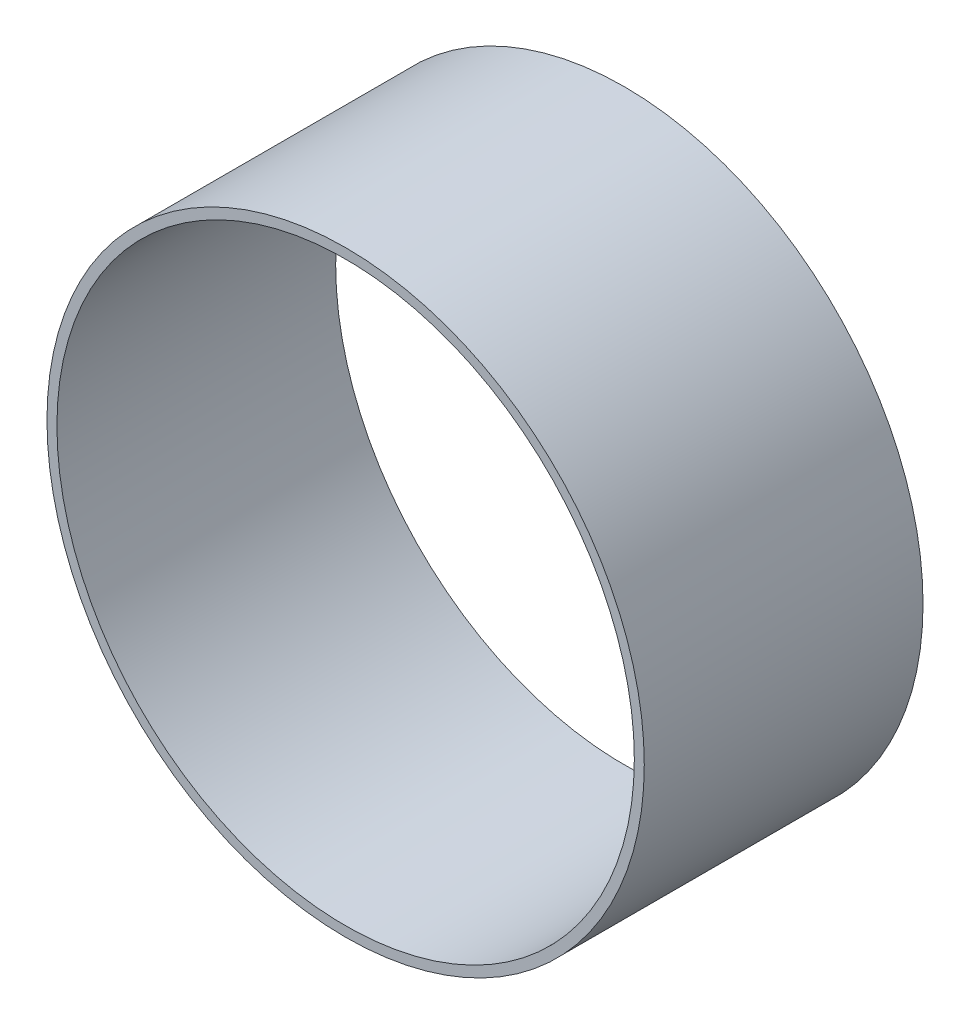
ISO-10303-21;
HEADER;
FILE_DESCRIPTION(('STEP AP214'),'2;1');
FILE_NAME('part.step','',(''),(''),'','','');
FILE_SCHEMA(('AUTOMOTIVE_DESIGN { 1 0 10303 214 1 1 1 1 }'));
ENDSEC;
DATA;
#1=APPLICATION_CONTEXT('core data for automotive mechanical design processes');
#2=APPLICATION_PROTOCOL_DEFINITION('international standard','automotive_design',2000,#1);
#3=PRODUCT_CONTEXT('',#1,'mechanical');
#4=PRODUCT('Part','Part','',(#3));
#5=PRODUCT_RELATED_PRODUCT_CATEGORY('part','',(#4));
#6=PRODUCT_DEFINITION_FORMATION('','',#4);
#7=PRODUCT_DEFINITION_CONTEXT('part definition',#1,'design');
#8=PRODUCT_DEFINITION('design','',#6,#7);
#9=PRODUCT_DEFINITION_SHAPE('','',#8);
#10=(LENGTH_UNIT() NAMED_UNIT(*) SI_UNIT(.MILLI.,.METRE.));
#11=(NAMED_UNIT(*) PLANE_ANGLE_UNIT() SI_UNIT($,.RADIAN.));
#12=(NAMED_UNIT(*) SI_UNIT($,.STERADIAN.) SOLID_ANGLE_UNIT());
#13=UNCERTAINTY_MEASURE_WITH_UNIT(LENGTH_MEASURE(1.E-05),#10,'distance_accuracy_value','');
#14=(GEOMETRIC_REPRESENTATION_CONTEXT(3) GLOBAL_UNCERTAINTY_ASSIGNED_CONTEXT((#13)) GLOBAL_UNIT_ASSIGNED_CONTEXT((#10,
#11,#12)) REPRESENTATION_CONTEXT('',''));
#15=CARTESIAN_POINT('',(0.,0.,0.));
#16=DIRECTION('',(0.,0.,1.));
#17=DIRECTION('',(1.,0.,0.));
#18=AXIS2_PLACEMENT_3D('',#15,#16,#17);
#19=CARTESIAN_POINT('',(0.,0.,28.));
#20=DIRECTION('',(0.,0.,1.));
#21=DIRECTION('',(1.,0.,0.));
#22=AXIS2_PLACEMENT_3D('',#19,#20,#21);
#23=PLANE('',#22);
#24=CARTESIAN_POINT('',(0.,0.,28.));
#25=DIRECTION('',(0.,0.,1.));
#26=DIRECTION('',(1.,0.,0.));
#27=AXIS2_PLACEMENT_3D('',#24,#25,#26);
#28=CIRCLE('',#27,30.);
#29=CARTESIAN_POINT('',(30.,0.,28.));
#30=VERTEX_POINT('',#29);
#31=EDGE_CURVE('E10',#30,#30,#28,.T.);
#32=ORIENTED_EDGE('',*,*,#31,.T.);
#33=EDGE_LOOP('',(#32));
#34=FACE_BOUND('',#33,.T.);
#35=CARTESIAN_POINT('',(0.,0.,28.));
#36=DIRECTION('',(0.,0.,1.));
#37=DIRECTION('',(1.,0.,0.));
#38=AXIS2_PLACEMENT_3D('',#35,#36,#37);
#39=CIRCLE('',#38,29.);
#40=CARTESIAN_POINT('',(29.,0.,28.));
#41=VERTEX_POINT('',#40);
#42=EDGE_CURVE('E45',#41,#41,#39,.T.);
#43=ORIENTED_EDGE('',*,*,#42,.F.);
#44=EDGE_LOOP('',(#43));
#45=FACE_BOUND('',#44,.T.);
#46=ADVANCED_FACE('F34',(#34,#45),#23,.T.);
#47=CARTESIAN_POINT('',(0.,0.,0.));
#48=DIRECTION('',(0.,0.,1.));
#49=DIRECTION('',(1.,0.,0.));
#50=AXIS2_PLACEMENT_3D('',#47,#48,#49);
#51=PLANE('',#50);
#52=CARTESIAN_POINT('',(0.,0.,0.));
#53=DIRECTION('',(0.,0.,1.));
#54=DIRECTION('',(1.,0.,0.));
#55=AXIS2_PLACEMENT_3D('',#52,#53,#54);
#56=CIRCLE('',#55,30.);
#57=CARTESIAN_POINT('',(30.,0.,0.));
#58=VERTEX_POINT('',#57);
#59=EDGE_CURVE('E38',#58,#58,#56,.T.);
#60=ORIENTED_EDGE('',*,*,#59,.F.);
#61=EDGE_LOOP('',(#60));
#62=FACE_BOUND('',#61,.T.);
#63=CARTESIAN_POINT('',(0.,0.,0.));
#64=DIRECTION('',(0.,0.,1.));
#65=DIRECTION('',(1.,0.,0.));
#66=AXIS2_PLACEMENT_3D('',#63,#64,#65);
#67=CIRCLE('',#66,29.);
#68=CARTESIAN_POINT('',(29.,0.,0.));
#69=VERTEX_POINT('',#68);
#70=EDGE_CURVE('E47',#69,#69,#67,.T.);
#71=ORIENTED_EDGE('',*,*,#70,.T.);
#72=EDGE_LOOP('',(#71));
#73=FACE_BOUND('',#72,.T.);
#74=ADVANCED_FACE('F57',(#62,#73),#51,.F.);
#75=CARTESIAN_POINT('',(0.,0.,28.));
#76=DIRECTION('',(0.,0.,-1.));
#77=DIRECTION('',(-1.,0.,0.));
#78=AXIS2_PLACEMENT_3D('',#75,#76,#77);
#79=CYLINDRICAL_SURFACE('',#78,30.);
#80=ORIENTED_EDGE('',*,*,#31,.F.);
#81=EDGE_LOOP('',(#80));
#82=FACE_BOUND('',#81,.T.);
#83=ORIENTED_EDGE('',*,*,#59,.T.);
#84=EDGE_LOOP('',(#83));
#85=FACE_BOUND('',#84,.T.);
#86=ADVANCED_FACE('F36',(#82,#85),#79,.T.);
#87=CARTESIAN_POINT('',(0.,0.,28.));
#88=DIRECTION('',(0.,0.,-1.));
#89=DIRECTION('',(-1.,0.,0.));
#90=AXIS2_PLACEMENT_3D('',#87,#88,#89);
#91=CYLINDRICAL_SURFACE('',#90,29.);
#92=ORIENTED_EDGE('',*,*,#42,.T.);
#93=EDGE_LOOP('',(#92));
#94=FACE_BOUND('',#93,.T.);
#95=ORIENTED_EDGE('',*,*,#70,.F.);
#96=EDGE_LOOP('',(#95));
#97=FACE_BOUND('',#96,.T.);
#98=ADVANCED_FACE('F53',(#94,#97),#91,.F.);
#99=CLOSED_SHELL('',(#46,#74,#86,#98));
#100=MANIFOLD_SOLID_BREP('B2',#99);
#101=ADVANCED_BREP_SHAPE_REPRESENTATION('',(#18,#100),#14);
#102=SHAPE_DEFINITION_REPRESENTATION(#9,#101);
ENDSEC;
END-ISO-10303-21;
